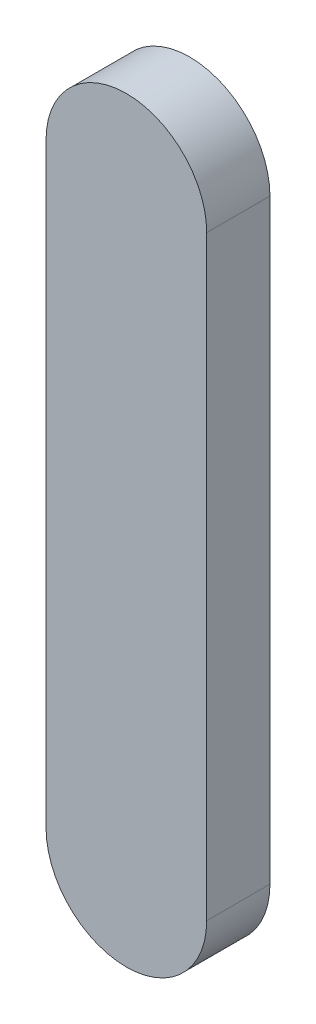
ISO-10303-21;
HEADER;
FILE_DESCRIPTION(('STEP AP214'),'2;1');
FILE_NAME('part.step','',(''),(''),'','','');
FILE_SCHEMA(('AUTOMOTIVE_DESIGN { 1 0 10303 214 1 1 1 1 }'));
ENDSEC;
DATA;
#1=APPLICATION_CONTEXT('core data for automotive mechanical design processes');
#2=APPLICATION_PROTOCOL_DEFINITION('international standard','automotive_design',2000,#1);
#3=PRODUCT_CONTEXT('',#1,'mechanical');
#4=PRODUCT('Part','Part','',(#3));
#5=PRODUCT_RELATED_PRODUCT_CATEGORY('part','',(#4));
#6=PRODUCT_DEFINITION_FORMATION('','',#4);
#7=PRODUCT_DEFINITION_CONTEXT('part definition',#1,'design');
#8=PRODUCT_DEFINITION('design','',#6,#7);
#9=PRODUCT_DEFINITION_SHAPE('','',#8);
#10=(LENGTH_UNIT() NAMED_UNIT(*) SI_UNIT(.MILLI.,.METRE.));
#11=(NAMED_UNIT(*) PLANE_ANGLE_UNIT() SI_UNIT($,.RADIAN.));
#12=(NAMED_UNIT(*) SI_UNIT($,.STERADIAN.) SOLID_ANGLE_UNIT());
#13=UNCERTAINTY_MEASURE_WITH_UNIT(LENGTH_MEASURE(1.E-05),#10,'distance_accuracy_value','');
#14=(GEOMETRIC_REPRESENTATION_CONTEXT(3) GLOBAL_UNCERTAINTY_ASSIGNED_CONTEXT((#13)) GLOBAL_UNIT_ASSIGNED_CONTEXT((#10,
#11,#12)) REPRESENTATION_CONTEXT('',''));
#15=CARTESIAN_POINT('',(0.,0.,0.));
#16=DIRECTION('',(0.,0.,1.));
#17=DIRECTION('',(1.,0.,0.));
#18=AXIS2_PLACEMENT_3D('',#15,#16,#17);
#19=CARTESIAN_POINT('',(149.098,108.7628,0.));
#20=DIRECTION('',(-1.,0.,0.));
#21=DIRECTION('',(0.,1.,0.));
#22=AXIS2_PLACEMENT_3D('',#19,#20,#21);
#23=PLANE('',#22);
#24=DIRECTION('',(0.,1.,0.));
#25=VECTOR('',#24,1.);
#26=CARTESIAN_POINT('',(149.098,108.7628,0.1999996));
#27=LINE('',#26,#25);
#28=CARTESIAN_POINT('',(149.098,108.7628,0.1999996));
#29=VERTEX_POINT('',#28);
#30=CARTESIAN_POINT('',(149.098,110.646972,0.1999996));
#31=VERTEX_POINT('',#30);
#32=EDGE_CURVE('E11',#29,#31,#27,.T.);
#33=ORIENTED_EDGE('',*,*,#32,.F.);
#34=DIRECTION('',(0.,0.,1.));
#35=VECTOR('',#34,1.);
#36=CARTESIAN_POINT('',(149.098,108.7628,0.));
#37=LINE('',#36,#35);
#38=CARTESIAN_POINT('',(149.098,108.7628,0.));
#39=VERTEX_POINT('',#38);
#40=EDGE_CURVE('E24',#39,#29,#37,.T.);
#41=ORIENTED_EDGE('',*,*,#40,.F.);
#42=DIRECTION('',(0.,1.,0.));
#43=VECTOR('',#42,1.);
#44=CARTESIAN_POINT('',(149.098,108.7628,0.));
#45=LINE('',#44,#43);
#46=CARTESIAN_POINT('',(149.098,110.646972,0.));
#47=VERTEX_POINT('',#46);
#48=EDGE_CURVE('E75',#39,#47,#45,.T.);
#49=ORIENTED_EDGE('',*,*,#48,.T.);
#50=DIRECTION('',(0.,0.,1.));
#51=VECTOR('',#50,1.);
#52=CARTESIAN_POINT('',(149.098,110.646972,0.));
#53=LINE('',#52,#51);
#54=EDGE_CURVE('E37',#47,#31,#53,.T.);
#55=ORIENTED_EDGE('',*,*,#54,.T.);
#56=EDGE_LOOP('',(#33,#41,#49,#55));
#57=FACE_BOUND('',#56,.T.);
#58=ADVANCED_FACE('F17',(#57),#23,.F.);
#59=CARTESIAN_POINT('',(148.844,110.646972,0.));
#60=DIRECTION('',(0.,0.,-1.));
#61=DIRECTION('',(1.,0.,0.));
#62=AXIS2_PLACEMENT_3D('',#59,#60,#61);
#63=CYLINDRICAL_SURFACE('',#62,0.25400000000001);
#64=CARTESIAN_POINT('',(148.844,110.646972,0.1999996));
#65=DIRECTION('',(0.,0.,1.));
#66=DIRECTION('',(1.,0.,0.));
#67=AXIS2_PLACEMENT_3D('',#64,#65,#66);
#68=CIRCLE('',#67,0.25400000000001);
#69=CARTESIAN_POINT('',(148.59,110.646972,0.1999996));
#70=VERTEX_POINT('',#69);
#71=EDGE_CURVE('E83',#31,#70,#68,.T.);
#72=ORIENTED_EDGE('',*,*,#71,.F.);
#73=ORIENTED_EDGE('',*,*,#54,.F.);
#74=CARTESIAN_POINT('',(148.844,110.646972,0.));
#75=DIRECTION('',(0.,0.,1.));
#76=DIRECTION('',(1.,0.,0.));
#77=AXIS2_PLACEMENT_3D('',#74,#75,#76);
#78=CIRCLE('',#77,0.25400000000001);
#79=CARTESIAN_POINT('',(148.59,110.646972,0.));
#80=VERTEX_POINT('',#79);
#81=EDGE_CURVE('E81',#47,#80,#78,.T.);
#82=ORIENTED_EDGE('',*,*,#81,.T.);
#83=DIRECTION('',(0.,0.,1.));
#84=VECTOR('',#83,1.);
#85=CARTESIAN_POINT('',(148.59,110.646972,0.));
#86=LINE('',#85,#84);
#87=EDGE_CURVE('E67',#80,#70,#86,.T.);
#88=ORIENTED_EDGE('',*,*,#87,.T.);
#89=EDGE_LOOP('',(#72,#73,#82,#88));
#90=FACE_BOUND('',#89,.T.);
#91=ADVANCED_FACE('F89',(#90),#63,.T.);
#92=CARTESIAN_POINT('',(148.59,110.646972,0.));
#93=DIRECTION('',(1.,0.,0.));
#94=DIRECTION('',(0.,-1.,0.));
#95=AXIS2_PLACEMENT_3D('',#92,#93,#94);
#96=PLANE('',#95);
#97=DIRECTION('',(0.,-1.,0.));
#98=VECTOR('',#97,1.);
#99=CARTESIAN_POINT('',(148.59,110.646972,0.1999996));
#100=LINE('',#99,#98);
#101=CARTESIAN_POINT('',(148.59,108.7628,0.1999996));
#102=VERTEX_POINT('',#101);
#103=EDGE_CURVE('E71',#70,#102,#100,.T.);
#104=ORIENTED_EDGE('',*,*,#103,.F.);
#105=ORIENTED_EDGE('',*,*,#87,.F.);
#106=DIRECTION('',(0.,-1.,0.));
#107=VECTOR('',#106,1.);
#108=CARTESIAN_POINT('',(148.59,110.646972,0.));
#109=LINE('',#108,#107);
#110=CARTESIAN_POINT('',(148.59,108.7628,0.));
#111=VERTEX_POINT('',#110);
#112=EDGE_CURVE('E63',#80,#111,#109,.T.);
#113=ORIENTED_EDGE('',*,*,#112,.T.);
#114=DIRECTION('',(0.,0.,1.));
#115=VECTOR('',#114,1.);
#116=CARTESIAN_POINT('',(148.59,108.7628,0.));
#117=LINE('',#116,#115);
#118=EDGE_CURVE('E53',#111,#102,#117,.T.);
#119=ORIENTED_EDGE('',*,*,#118,.T.);
#120=EDGE_LOOP('',(#104,#105,#113,#119));
#121=FACE_BOUND('',#120,.T.);
#122=ADVANCED_FACE('F66',(#121),#96,.F.);
#123=CARTESIAN_POINT('',(148.844,108.7628,0.));
#124=DIRECTION('',(0.,0.,-1.));
#125=DIRECTION('',(-1.,0.,0.));
#126=AXIS2_PLACEMENT_3D('',#123,#124,#125);
#127=CYLINDRICAL_SURFACE('',#126,0.254000000000005);
#128=CARTESIAN_POINT('',(148.844,108.7628,0.1999996));
#129=DIRECTION('',(0.,0.,1.));
#130=DIRECTION('',(-1.,0.,0.));
#131=AXIS2_PLACEMENT_3D('',#128,#129,#130);
#132=CIRCLE('',#131,0.254000000000005);
#133=EDGE_CURVE('E59',#102,#29,#132,.T.);
#134=ORIENTED_EDGE('',*,*,#133,.F.);
#135=ORIENTED_EDGE('',*,*,#118,.F.);
#136=CARTESIAN_POINT('',(148.844,108.7628,0.));
#137=DIRECTION('',(0.,0.,1.));
#138=DIRECTION('',(-1.,0.,0.));
#139=AXIS2_PLACEMENT_3D('',#136,#137,#138);
#140=CIRCLE('',#139,0.254000000000005);
#141=EDGE_CURVE('E57',#111,#39,#140,.T.);
#142=ORIENTED_EDGE('',*,*,#141,.T.);
#143=ORIENTED_EDGE('',*,*,#40,.T.);
#144=EDGE_LOOP('',(#134,#135,#142,#143));
#145=FACE_BOUND('',#144,.T.);
#146=ADVANCED_FACE('F55',(#145),#127,.T.);
#147=CARTESIAN_POINT('',(149.098,108.7628,0.));
#148=DIRECTION('',(0.,0.,-1.));
#149=DIRECTION('',(-1.,0.,0.));
#150=AXIS2_PLACEMENT_3D('',#147,#148,#149);
#151=PLANE('',#150);
#152=ORIENTED_EDGE('',*,*,#141,.F.);
#153=ORIENTED_EDGE('',*,*,#112,.F.);
#154=ORIENTED_EDGE('',*,*,#81,.F.);
#155=ORIENTED_EDGE('',*,*,#48,.F.);
#156=EDGE_LOOP('',(#152,#153,#154,#155));
#157=FACE_BOUND('',#156,.T.);
#158=ADVANCED_FACE('F74',(#157),#151,.T.);
#159=CARTESIAN_POINT('',(149.098,108.7628,0.1999996));
#160=DIRECTION('',(0.,0.,-1.));
#161=DIRECTION('',(-1.,0.,0.));
#162=AXIS2_PLACEMENT_3D('',#159,#160,#161);
#163=PLANE('',#162);
#164=ORIENTED_EDGE('',*,*,#32,.T.);
#165=ORIENTED_EDGE('',*,*,#71,.T.);
#166=ORIENTED_EDGE('',*,*,#103,.T.);
#167=ORIENTED_EDGE('',*,*,#133,.T.);
#168=EDGE_LOOP('',(#164,#165,#166,#167));
#169=FACE_BOUND('',#168,.T.);
#170=ADVANCED_FACE('F91',(#169),#163,.F.);
#171=CLOSED_SHELL('',(#58,#91,#122,#146,#158,#170));
#172=MANIFOLD_SOLID_BREP('B1',#171);
#173=ADVANCED_BREP_SHAPE_REPRESENTATION('',(#18,#172),#14);
#174=SHAPE_DEFINITION_REPRESENTATION(#9,#173);
ENDSEC;
END-ISO-10303-21;
